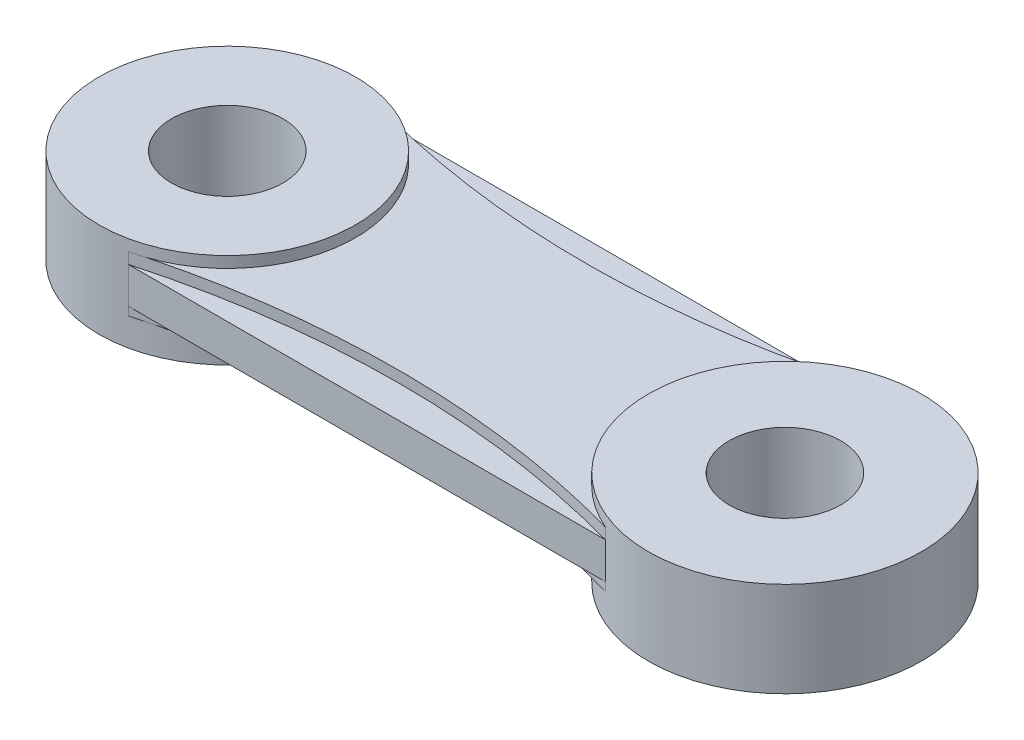
ISO-10303-21;
HEADER;
FILE_DESCRIPTION(('STEP AP214'),'2;1');
FILE_NAME('part.step','',(''),(''),'','','');
FILE_SCHEMA(('AUTOMOTIVE_DESIGN { 1 0 10303 214 1 1 1 1 }'));
ENDSEC;
DATA;
#1=APPLICATION_CONTEXT('core data for automotive mechanical design processes');
#2=APPLICATION_PROTOCOL_DEFINITION('international standard','automotive_design',2000,#1);
#3=PRODUCT_CONTEXT('',#1,'mechanical');
#4=PRODUCT('Part','Part','',(#3));
#5=PRODUCT_RELATED_PRODUCT_CATEGORY('part','',(#4));
#6=PRODUCT_DEFINITION_FORMATION('','',#4);
#7=PRODUCT_DEFINITION_CONTEXT('part definition',#1,'design');
#8=PRODUCT_DEFINITION('design','',#6,#7);
#9=PRODUCT_DEFINITION_SHAPE('','',#8);
#10=(LENGTH_UNIT() NAMED_UNIT(*) SI_UNIT(.MILLI.,.METRE.));
#11=(NAMED_UNIT(*) PLANE_ANGLE_UNIT() SI_UNIT($,.RADIAN.));
#12=(NAMED_UNIT(*) SI_UNIT($,.STERADIAN.) SOLID_ANGLE_UNIT());
#13=UNCERTAINTY_MEASURE_WITH_UNIT(LENGTH_MEASURE(1.E-05),#10,'distance_accuracy_value','');
#14=(GEOMETRIC_REPRESENTATION_CONTEXT(3) GLOBAL_UNCERTAINTY_ASSIGNED_CONTEXT((#13)) GLOBAL_UNIT_ASSIGNED_CONTEXT((#10,
#11,#12)) REPRESENTATION_CONTEXT('',''));
#15=CARTESIAN_POINT('',(0.,0.,0.));
#16=DIRECTION('',(0.,0.,1.));
#17=DIRECTION('',(1.,0.,0.));
#18=AXIS2_PLACEMENT_3D('',#15,#16,#17);
#19=CARTESIAN_POINT('',(0.,100.,0.));
#20=DIRECTION('',(0.,0.,-1.));
#21=DIRECTION('',(-1.,0.,0.));
#22=AXIS2_PLACEMENT_3D('',#19,#20,#21);
#23=PLANE('',#22);
#24=DIRECTION('',(-1.,0.,0.));
#25=VECTOR('',#24,1.);
#26=CARTESIAN_POINT('',(47.6969600708473,15.,0.));
#27=LINE('',#26,#25);
#28=CARTESIAN_POINT('',(903.046402851673,15.,0.));
#29=VERTEX_POINT('',#28);
#30=CARTESIAN_POINT('',(47.6969600708473,15.,0.));
#31=VERTEX_POINT('',#30);
#32=EDGE_CURVE('E234',#29,#31,#27,.T.);
#33=ORIENTED_EDGE('',*,*,#32,.F.);
#34=DIRECTION('',(0.,1.,0.));
#35=VECTOR('',#34,1.);
#36=CARTESIAN_POINT('',(903.046402851673,-50.,0.));
#37=LINE('',#36,#35);
#38=CARTESIAN_POINT('',(903.046402851673,80.,0.));
#39=VERTEX_POINT('',#38);
#40=EDGE_CURVE('E162',#29,#39,#37,.T.);
#41=ORIENTED_EDGE('',*,*,#40,.T.);
#42=DIRECTION('',(1.,0.,0.));
#43=VECTOR('',#42,1.);
#44=CARTESIAN_POINT('',(47.6969600708473,80.,0.));
#45=LINE('',#44,#43);
#46=CARTESIAN_POINT('',(47.6969600708473,80.,0.));
#47=VERTEX_POINT('',#46);
#48=EDGE_CURVE('E199',#47,#39,#45,.T.);
#49=ORIENTED_EDGE('',*,*,#48,.F.);
#50=DIRECTION('',(0.,1.,0.));
#51=VECTOR('',#50,1.);
#52=CARTESIAN_POINT('',(47.6969600708473,-50.,0.));
#53=LINE('',#52,#51);
#54=EDGE_CURVE('E120',#47,#31,#53,.F.);
#55=ORIENTED_EDGE('',*,*,#54,.T.);
#56=EDGE_LOOP('',(#33,#41,#49,#55));
#57=FACE_BOUND('',#56,.T.);
#58=ADVANCED_FACE('F32',(#57),#23,.F.);
#59=CARTESIAN_POINT('',(0.,100.,-450.));
#60=DIRECTION('',(0.,0.,1.));
#61=DIRECTION('',(1.,0.,0.));
#62=AXIS2_PLACEMENT_3D('',#59,#60,#61);
#63=PLANE('',#62);
#64=DIRECTION('',(0.,1.,0.));
#65=VECTOR('',#64,1.);
#66=CARTESIAN_POINT('',(903.046402851673,-50.,-450.));
#67=LINE('',#66,#65);
#68=CARTESIAN_POINT('',(903.046402851673,80.,-450.));
#69=VERTEX_POINT('',#68);
#70=CARTESIAN_POINT('',(903.046402851673,15.,-450.));
#71=VERTEX_POINT('',#70);
#72=EDGE_CURVE('E135',#69,#71,#67,.F.);
#73=ORIENTED_EDGE('',*,*,#72,.T.);
#74=DIRECTION('',(1.,0.,0.));
#75=VECTOR('',#74,1.);
#76=CARTESIAN_POINT('',(47.6969600708473,15.,-450.));
#77=LINE('',#76,#75);
#78=CARTESIAN_POINT('',(47.6969600708473,15.,-450.));
#79=VERTEX_POINT('',#78);
#80=EDGE_CURVE('E126',#79,#71,#77,.T.);
#81=ORIENTED_EDGE('',*,*,#80,.F.);
#82=DIRECTION('',(0.,1.,0.));
#83=VECTOR('',#82,1.);
#84=CARTESIAN_POINT('',(47.6969600708473,-50.,-450.));
#85=LINE('',#84,#83);
#86=CARTESIAN_POINT('',(47.6969600708473,80.,-450.));
#87=VERTEX_POINT('',#86);
#88=EDGE_CURVE('E121',#79,#87,#85,.T.);
#89=ORIENTED_EDGE('',*,*,#88,.T.);
#90=DIRECTION('',(-1.,0.,0.));
#91=VECTOR('',#90,1.);
#92=CARTESIAN_POINT('',(47.6969600708473,80.,-450.));
#93=LINE('',#92,#91);
#94=EDGE_CURVE('E190',#69,#87,#93,.T.);
#95=ORIENTED_EDGE('',*,*,#94,.F.);
#96=EDGE_LOOP('',(#73,#81,#89,#95));
#97=FACE_BOUND('',#96,.T.);
#98=ADVANCED_FACE('F131',(#97),#63,.F.);
#99=CARTESIAN_POINT('',(0.,100.,0.));
#100=DIRECTION('',(0.,-1.,0.));
#101=DIRECTION('',(0.,0.,-1.));
#102=AXIS2_PLACEMENT_3D('',#99,#100,#101);
#103=PLANE('',#102);
#104=CARTESIAN_POINT('',(1000.,100.,-225.));
#105=DIRECTION('',(0.,-1.,0.));
#106=DIRECTION('',(0.,0.,-1.));
#107=AXIS2_PLACEMENT_3D('',#104,#105,#106);
#108=CIRCLE('',#107,245.);
#109=CARTESIAN_POINT('',(903.046402851673,100.,0.));
#110=VERTEX_POINT('',#109);
#111=CARTESIAN_POINT('',(903.046402851673,100.,-450.));
#112=VERTEX_POINT('',#111);
#113=EDGE_CURVE('E165',#110,#112,#108,.T.);
#114=ORIENTED_EDGE('',*,*,#113,.T.);
#115=CARTESIAN_POINT('',(475.37168146126,100.,-1991.7828422588));
#116=DIRECTION('',(0.,1.,0.));
#117=DIRECTION('',(0.,0.,1.));
#118=AXIS2_PLACEMENT_3D('',#115,#116,#117);
#119=CIRCLE('',#118,1600.);
#120=CARTESIAN_POINT('',(71.6465221432204,100.,-443.556116054393));
#121=VERTEX_POINT('',#120);
#122=EDGE_CURVE('E172',#121,#112,#119,.T.);
#123=ORIENTED_EDGE('',*,*,#122,.F.);
#124=CARTESIAN_POINT('',(0.,100.,-225.));
#125=DIRECTION('',(0.,-1.,0.));
#126=DIRECTION('',(0.,0.,-1.));
#127=AXIS2_PLACEMENT_3D('',#124,#125,#126);
#128=CIRCLE('',#127,230.);
#129=CARTESIAN_POINT('',(71.6465221432031,100.,-6.44388394560197));
#130=VERTEX_POINT('',#129);
#131=EDGE_CURVE('E57',#121,#130,#128,.T.);
#132=ORIENTED_EDGE('',*,*,#131,.T.);
#133=CARTESIAN_POINT('',(475.37168146126,100.,1541.7828422588));
#134=DIRECTION('',(0.,1.,0.));
#135=DIRECTION('',(0.,0.,-1.));
#136=AXIS2_PLACEMENT_3D('',#133,#134,#135);
#137=CIRCLE('',#136,1600.);
#138=EDGE_CURVE('E200',#110,#130,#137,.T.);
#139=ORIENTED_EDGE('',*,*,#138,.F.);
#140=EDGE_LOOP('',(#114,#123,#132,#139));
#141=FACE_BOUND('',#140,.T.);
#142=ADVANCED_FACE('F230',(#141),#103,.F.);
#143=CARTESIAN_POINT('',(0.,0.,0.));
#144=DIRECTION('',(0.,-1.,0.));
#145=DIRECTION('',(0.,0.,-1.));
#146=AXIS2_PLACEMENT_3D('',#143,#144,#145);
#147=PLANE('',#146);
#148=CARTESIAN_POINT('',(475.37168146126,0.,-1991.7828422588));
#149=DIRECTION('',(0.,-1.,0.));
#150=DIRECTION('',(0.,0.,1.));
#151=AXIS2_PLACEMENT_3D('',#148,#149,#150);
#152=CIRCLE('',#151,1600.);
#153=CARTESIAN_POINT('',(903.046402851673,0.,-450.));
#154=VERTEX_POINT('',#153);
#155=CARTESIAN_POINT('',(71.6465221432202,0.,-443.556116054392));
#156=VERTEX_POINT('',#155);
#157=EDGE_CURVE('E49',#154,#156,#152,.T.);
#158=ORIENTED_EDGE('',*,*,#157,.F.);
#159=CARTESIAN_POINT('',(1000.,0.,-225.));
#160=DIRECTION('',(0.,-1.,0.));
#161=DIRECTION('',(0.,0.,-1.));
#162=AXIS2_PLACEMENT_3D('',#159,#160,#161);
#163=CIRCLE('',#162,245.);
#164=CARTESIAN_POINT('',(903.046402851673,0.,0.));
#165=VERTEX_POINT('',#164);
#166=EDGE_CURVE('E168',#165,#154,#163,.T.);
#167=ORIENTED_EDGE('',*,*,#166,.F.);
#168=CARTESIAN_POINT('',(475.37168146126,0.,1541.7828422588));
#169=DIRECTION('',(0.,-1.,0.));
#170=DIRECTION('',(0.,0.,-1.));
#171=AXIS2_PLACEMENT_3D('',#168,#169,#170);
#172=CIRCLE('',#171,1600.);
#173=CARTESIAN_POINT('',(71.6465221432031,0.,-6.44388394560202));
#174=VERTEX_POINT('',#173);
#175=EDGE_CURVE('E451',#174,#165,#172,.T.);
#176=ORIENTED_EDGE('',*,*,#175,.F.);
#177=CARTESIAN_POINT('',(0.,0.,-225.));
#178=DIRECTION('',(0.,-1.,0.));
#179=DIRECTION('',(0.,0.,-1.));
#180=AXIS2_PLACEMENT_3D('',#177,#178,#179);
#181=CIRCLE('',#180,230.);
#182=EDGE_CURVE('E40',#156,#174,#181,.T.);
#183=ORIENTED_EDGE('',*,*,#182,.F.);
#184=EDGE_LOOP('',(#158,#167,#176,#183));
#185=FACE_BOUND('',#184,.T.);
#186=ADVANCED_FACE('F373',(#185),#147,.T.);
#187=CARTESIAN_POINT('',(1000.,-50.,-225.));
#188=DIRECTION('',(0.,1.,0.));
#189=DIRECTION('',(0.,0.,1.));
#190=AXIS2_PLACEMENT_3D('',#187,#188,#189);
#191=CYLINDRICAL_SURFACE('',#190,245.);
#192=CARTESIAN_POINT('',(1000.,120.,-225.));
#193=DIRECTION('',(0.,1.,0.));
#194=DIRECTION('',(0.,0.,1.));
#195=AXIS2_PLACEMENT_3D('',#192,#193,#194);
#196=CIRCLE('',#195,245.);
#197=CARTESIAN_POINT('',(1000.,120.,20.));
#198=VERTEX_POINT('',#197);
#199=EDGE_CURVE('E154',#198,#198,#196,.T.);
#200=ORIENTED_EDGE('',*,*,#199,.F.);
#201=EDGE_LOOP('',(#200));
#202=FACE_BOUND('',#201,.T.);
#203=CARTESIAN_POINT('',(1000.,-50.,-225.));
#204=DIRECTION('',(0.,1.,0.));
#205=DIRECTION('',(0.,0.,1.));
#206=AXIS2_PLACEMENT_3D('',#203,#204,#205);
#207=CIRCLE('',#206,245.);
#208=CARTESIAN_POINT('',(1000.,-50.,20.));
#209=VERTEX_POINT('',#208);
#210=EDGE_CURVE('E157',#209,#209,#207,.T.);
#211=ORIENTED_EDGE('',*,*,#210,.T.);
#212=EDGE_LOOP('',(#211));
#213=FACE_BOUND('',#212,.T.);
#214=ORIENTED_EDGE('',*,*,#113,.F.);
#215=DIRECTION('',(0.,1.,0.));
#216=VECTOR('',#215,1.);
#217=CARTESIAN_POINT('',(903.046402851673,80.,0.));
#218=LINE('',#217,#216);
#219=EDGE_CURVE('E203',#39,#110,#218,.T.);
#220=ORIENTED_EDGE('',*,*,#219,.F.);
#221=ORIENTED_EDGE('',*,*,#40,.F.);
#222=EDGE_CURVE('E163',#165,#29,#37,.T.);
#223=ORIENTED_EDGE('',*,*,#222,.F.);
#224=ORIENTED_EDGE('',*,*,#166,.T.);
#225=DIRECTION('',(0.,-1.,0.));
#226=VECTOR('',#225,1.);
#227=CARTESIAN_POINT('',(903.046402851673,15.,-450.));
#228=LINE('',#227,#226);
#229=EDGE_CURVE('E136',#71,#154,#228,.T.);
#230=ORIENTED_EDGE('',*,*,#229,.F.);
#231=ORIENTED_EDGE('',*,*,#72,.F.);
#232=EDGE_CURVE('E160',#112,#69,#67,.F.);
#233=ORIENTED_EDGE('',*,*,#232,.F.);
#234=EDGE_LOOP('',(#214,#220,#221,#223,#224,#230,#231,#233));
#235=FACE_BOUND('',#234,.T.);
#236=ADVANCED_FACE('F249',(#202,#213,#235),#191,.T.);
#237=CARTESIAN_POINT('',(1000.,-50.,-225.));
#238=DIRECTION('',(0.,1.,0.));
#239=DIRECTION('',(0.,0.,1.));
#240=AXIS2_PLACEMENT_3D('',#237,#238,#239);
#241=PLANE('',#240);
#242=CARTESIAN_POINT('',(1000.,-50.,-225.));
#243=DIRECTION('',(0.,1.,0.));
#244=DIRECTION('',(0.,0.,1.));
#245=AXIS2_PLACEMENT_3D('',#242,#243,#244);
#246=CIRCLE('',#245,100.);
#247=CARTESIAN_POINT('',(1000.,-50.,-125.));
#248=VERTEX_POINT('',#247);
#249=EDGE_CURVE('E183',#248,#248,#246,.T.);
#250=ORIENTED_EDGE('',*,*,#249,.T.);
#251=EDGE_LOOP('',(#250));
#252=FACE_BOUND('',#251,.T.);
#253=ORIENTED_EDGE('',*,*,#210,.F.);
#254=EDGE_LOOP('',(#253));
#255=FACE_BOUND('',#254,.T.);
#256=ADVANCED_FACE('F315',(#252,#255),#241,.F.);
#257=CARTESIAN_POINT('',(1000.,120.,-225.));
#258=DIRECTION('',(0.,1.,0.));
#259=DIRECTION('',(0.,0.,1.));
#260=AXIS2_PLACEMENT_3D('',#257,#258,#259);
#261=PLANE('',#260);
#262=CARTESIAN_POINT('',(1000.,120.,-225.));
#263=DIRECTION('',(0.,1.,0.));
#264=DIRECTION('',(0.,0.,1.));
#265=AXIS2_PLACEMENT_3D('',#262,#263,#264);
#266=CIRCLE('',#265,100.);
#267=CARTESIAN_POINT('',(1000.,120.,-125.));
#268=VERTEX_POINT('',#267);
#269=EDGE_CURVE('E35',#268,#268,#266,.T.);
#270=ORIENTED_EDGE('',*,*,#269,.F.);
#271=EDGE_LOOP('',(#270));
#272=FACE_BOUND('',#271,.T.);
#273=ORIENTED_EDGE('',*,*,#199,.T.);
#274=EDGE_LOOP('',(#273));
#275=FACE_BOUND('',#274,.T.);
#276=ADVANCED_FACE('F213',(#272,#275),#261,.T.);
#277=CARTESIAN_POINT('',(0.,-50.,-225.));
#278=DIRECTION('',(0.,1.,0.));
#279=DIRECTION('',(0.,0.,1.));
#280=AXIS2_PLACEMENT_3D('',#277,#278,#279);
#281=CYLINDRICAL_SURFACE('',#280,230.);
#282=CARTESIAN_POINT('',(0.,120.,-225.));
#283=DIRECTION('',(0.,1.,0.));
#284=DIRECTION('',(0.,0.,1.));
#285=AXIS2_PLACEMENT_3D('',#282,#283,#284);
#286=CIRCLE('',#285,230.);
#287=CARTESIAN_POINT('',(0.,120.,5.));
#288=VERTEX_POINT('',#287);
#289=EDGE_CURVE('E145',#288,#288,#286,.T.);
#290=ORIENTED_EDGE('',*,*,#289,.F.);
#291=EDGE_LOOP('',(#290));
#292=FACE_BOUND('',#291,.T.);
#293=CARTESIAN_POINT('',(0.,-50.,-225.));
#294=DIRECTION('',(0.,1.,0.));
#295=DIRECTION('',(0.,0.,1.));
#296=AXIS2_PLACEMENT_3D('',#293,#294,#295);
#297=CIRCLE('',#296,230.);
#298=CARTESIAN_POINT('',(0.,-50.,5.));
#299=VERTEX_POINT('',#298);
#300=EDGE_CURVE('E143',#299,#299,#297,.T.);
#301=ORIENTED_EDGE('',*,*,#300,.T.);
#302=EDGE_LOOP('',(#301));
#303=FACE_BOUND('',#302,.T.);
#304=CARTESIAN_POINT('',(47.6969600708473,100.,-450.));
#305=VERTEX_POINT('',#304);
#306=EDGE_CURVE('E152',#305,#121,#128,.T.);
#307=ORIENTED_EDGE('',*,*,#306,.F.);
#308=DIRECTION('',(0.,1.,0.));
#309=VECTOR('',#308,1.);
#310=CARTESIAN_POINT('',(47.6969600708473,80.,-450.));
#311=LINE('',#310,#309);
#312=EDGE_CURVE('E142',#87,#305,#311,.T.);
#313=ORIENTED_EDGE('',*,*,#312,.F.);
#314=ORIENTED_EDGE('',*,*,#88,.F.);
#315=CARTESIAN_POINT('',(47.6969600708473,0.,-450.));
#316=VERTEX_POINT('',#315);
#317=EDGE_CURVE('E112',#316,#79,#85,.T.);
#318=ORIENTED_EDGE('',*,*,#317,.F.);
#319=EDGE_CURVE('E11',#316,#156,#181,.T.);
#320=ORIENTED_EDGE('',*,*,#319,.T.);
#321=ORIENTED_EDGE('',*,*,#182,.T.);
#322=CARTESIAN_POINT('',(47.6969600708473,0.,0.));
#323=VERTEX_POINT('',#322);
#324=EDGE_CURVE('E42',#174,#323,#181,.T.);
#325=ORIENTED_EDGE('',*,*,#324,.T.);
#326=DIRECTION('',(0.,-1.,0.));
#327=VECTOR('',#326,1.);
#328=CARTESIAN_POINT('',(47.6969600708473,15.,0.));
#329=LINE('',#328,#327);
#330=EDGE_CURVE('E242',#31,#323,#329,.T.);
#331=ORIENTED_EDGE('',*,*,#330,.F.);
#332=ORIENTED_EDGE('',*,*,#54,.F.);
#333=CARTESIAN_POINT('',(47.6969600708473,100.,0.));
#334=VERTEX_POINT('',#333);
#335=EDGE_CURVE('E149',#334,#47,#53,.F.);
#336=ORIENTED_EDGE('',*,*,#335,.F.);
#337=EDGE_CURVE('E151',#130,#334,#128,.T.);
#338=ORIENTED_EDGE('',*,*,#337,.F.);
#339=ORIENTED_EDGE('',*,*,#131,.F.);
#340=EDGE_LOOP('',(#307,#313,#314,#318,#320,#321,#325,#331,#332,#336,#338,#339));
#341=FACE_BOUND('',#340,.T.);
#342=ADVANCED_FACE('F140',(#292,#303,#341),#281,.T.);
#343=CARTESIAN_POINT('',(0.,-50.,-225.));
#344=DIRECTION('',(0.,1.,0.));
#345=DIRECTION('',(0.,0.,1.));
#346=AXIS2_PLACEMENT_3D('',#343,#344,#345);
#347=PLANE('',#346);
#348=CARTESIAN_POINT('',(0.,-50.,-225.));
#349=DIRECTION('',(0.,1.,0.));
#350=DIRECTION('',(0.,0.,1.));
#351=AXIS2_PLACEMENT_3D('',#348,#349,#350);
#352=CIRCLE('',#351,100.);
#353=CARTESIAN_POINT('',(0.,-50.,-125.));
#354=VERTEX_POINT('',#353);
#355=EDGE_CURVE('E173',#354,#354,#352,.T.);
#356=ORIENTED_EDGE('',*,*,#355,.T.);
#357=EDGE_LOOP('',(#356));
#358=FACE_BOUND('',#357,.T.);
#359=ORIENTED_EDGE('',*,*,#300,.F.);
#360=EDGE_LOOP('',(#359));
#361=FACE_BOUND('',#360,.T.);
#362=ADVANCED_FACE('F212',(#358,#361),#347,.F.);
#363=CARTESIAN_POINT('',(0.,120.,-225.));
#364=DIRECTION('',(0.,1.,0.));
#365=DIRECTION('',(0.,0.,1.));
#366=AXIS2_PLACEMENT_3D('',#363,#364,#365);
#367=PLANE('',#366);
#368=CARTESIAN_POINT('',(0.,120.,-225.));
#369=DIRECTION('',(0.,1.,0.));
#370=DIRECTION('',(0.,0.,1.));
#371=AXIS2_PLACEMENT_3D('',#368,#369,#370);
#372=CIRCLE('',#371,100.);
#373=CARTESIAN_POINT('',(0.,120.,-125.));
#374=VERTEX_POINT('',#373);
#375=EDGE_CURVE('E170',#374,#374,#372,.T.);
#376=ORIENTED_EDGE('',*,*,#375,.F.);
#377=EDGE_LOOP('',(#376));
#378=FACE_BOUND('',#377,.T.);
#379=ORIENTED_EDGE('',*,*,#289,.T.);
#380=EDGE_LOOP('',(#379));
#381=FACE_BOUND('',#380,.T.);
#382=ADVANCED_FACE('F208',(#378,#381),#367,.T.);
#383=CARTESIAN_POINT('',(475.37168146126,80.,1541.7828422588));
#384=DIRECTION('',(0.,1.,0.));
#385=DIRECTION('',(0.,0.,1.));
#386=AXIS2_PLACEMENT_3D('',#383,#384,#385);
#387=CYLINDRICAL_SURFACE('',#386,1600.);
#388=ORIENTED_EDGE('',*,*,#138,.T.);
#389=EDGE_CURVE('E195',#130,#334,#137,.T.);
#390=ORIENTED_EDGE('',*,*,#389,.T.);
#391=ORIENTED_EDGE('',*,*,#335,.T.);
#392=CARTESIAN_POINT('',(475.37168146126,80.,1541.7828422588));
#393=DIRECTION('',(0.,1.,0.));
#394=DIRECTION('',(0.,0.,-1.));
#395=AXIS2_PLACEMENT_3D('',#392,#393,#394);
#396=CIRCLE('',#395,1600.);
#397=EDGE_CURVE('E196',#39,#47,#396,.T.);
#398=ORIENTED_EDGE('',*,*,#397,.F.);
#399=ORIENTED_EDGE('',*,*,#219,.T.);
#400=EDGE_LOOP('',(#388,#390,#391,#398,#399));
#401=FACE_BOUND('',#400,.T.);
#402=ADVANCED_FACE('F222',(#401),#387,.F.);
#403=CARTESIAN_POINT('',(475.37168146126,80.,1541.7828422588));
#404=DIRECTION('',(0.,-1.,0.));
#405=DIRECTION('',(0.,0.,-1.));
#406=AXIS2_PLACEMENT_3D('',#403,#404,#405);
#407=PLANE('',#406);
#408=ORIENTED_EDGE('',*,*,#397,.T.);
#409=ORIENTED_EDGE('',*,*,#48,.T.);
#410=EDGE_LOOP('',(#408,#409));
#411=FACE_BOUND('',#410,.T.);
#412=ADVANCED_FACE('F273',(#411),#407,.F.);
#413=CARTESIAN_POINT('',(475.37168146126,100.,1541.7828422588));
#414=DIRECTION('',(0.,-1.,0.));
#415=DIRECTION('',(0.,0.,-1.));
#416=AXIS2_PLACEMENT_3D('',#413,#414,#415);
#417=PLANE('',#416);
#418=ORIENTED_EDGE('',*,*,#389,.F.);
#419=ORIENTED_EDGE('',*,*,#337,.T.);
#420=EDGE_LOOP('',(#418,#419));
#421=FACE_BOUND('',#420,.T.);
#422=ADVANCED_FACE('F268',(#421),#417,.T.);
#423=CARTESIAN_POINT('',(475.37168146126,80.,-1991.7828422588));
#424=DIRECTION('',(0.,1.,0.));
#425=DIRECTION('',(0.,0.,1.));
#426=AXIS2_PLACEMENT_3D('',#423,#424,#425);
#427=CYLINDRICAL_SURFACE('',#426,1600.);
#428=EDGE_CURVE('E176',#305,#121,#119,.T.);
#429=ORIENTED_EDGE('',*,*,#428,.T.);
#430=ORIENTED_EDGE('',*,*,#122,.T.);
#431=ORIENTED_EDGE('',*,*,#232,.T.);
#432=CARTESIAN_POINT('',(475.37168146126,80.,-1991.7828422588));
#433=DIRECTION('',(0.,1.,0.));
#434=DIRECTION('',(0.,0.,1.));
#435=AXIS2_PLACEMENT_3D('',#432,#433,#434);
#436=CIRCLE('',#435,1600.);
#437=EDGE_CURVE('E187',#87,#69,#436,.T.);
#438=ORIENTED_EDGE('',*,*,#437,.F.);
#439=ORIENTED_EDGE('',*,*,#312,.T.);
#440=EDGE_LOOP('',(#429,#430,#431,#438,#439));
#441=FACE_BOUND('',#440,.T.);
#442=ADVANCED_FACE('F255',(#441),#427,.F.);
#443=CARTESIAN_POINT('',(475.37168146126,80.,-1991.7828422588));
#444=DIRECTION('',(0.,1.,0.));
#445=DIRECTION('',(0.,0.,1.));
#446=AXIS2_PLACEMENT_3D('',#443,#444,#445);
#447=PLANE('',#446);
#448=ORIENTED_EDGE('',*,*,#437,.T.);
#449=ORIENTED_EDGE('',*,*,#94,.T.);
#450=EDGE_LOOP('',(#448,#449));
#451=FACE_BOUND('',#450,.T.);
#452=ADVANCED_FACE('F257',(#451),#447,.T.);
#453=CARTESIAN_POINT('',(475.37168146126,100.,-1991.7828422588));
#454=DIRECTION('',(0.,1.,0.));
#455=DIRECTION('',(0.,0.,1.));
#456=AXIS2_PLACEMENT_3D('',#453,#454,#455);
#457=PLANE('',#456);
#458=ORIENTED_EDGE('',*,*,#306,.T.);
#459=ORIENTED_EDGE('',*,*,#428,.F.);
#460=EDGE_LOOP('',(#458,#459));
#461=FACE_BOUND('',#460,.T.);
#462=ADVANCED_FACE('F259',(#461),#457,.F.);
#463=CARTESIAN_POINT('',(0.,-50.,-225.));
#464=DIRECTION('',(0.,1.,0.));
#465=DIRECTION('',(0.,0.,1.));
#466=AXIS2_PLACEMENT_3D('',#463,#464,#465);
#467=CYLINDRICAL_SURFACE('',#466,100.);
#468=ORIENTED_EDGE('',*,*,#375,.T.);
#469=EDGE_LOOP('',(#468));
#470=FACE_BOUND('',#469,.T.);
#471=ORIENTED_EDGE('',*,*,#355,.F.);
#472=EDGE_LOOP('',(#471));
#473=FACE_BOUND('',#472,.T.);
#474=ADVANCED_FACE('F265',(#470,#473),#467,.F.);
#475=CARTESIAN_POINT('',(1000.,-50.,-225.));
#476=DIRECTION('',(0.,1.,0.));
#477=DIRECTION('',(0.,0.,1.));
#478=AXIS2_PLACEMENT_3D('',#475,#476,#477);
#479=CYLINDRICAL_SURFACE('',#478,100.);
#480=ORIENTED_EDGE('',*,*,#269,.T.);
#481=EDGE_LOOP('',(#480));
#482=FACE_BOUND('',#481,.T.);
#483=ORIENTED_EDGE('',*,*,#249,.F.);
#484=EDGE_LOOP('',(#483));
#485=FACE_BOUND('',#484,.T.);
#486=ADVANCED_FACE('F348',(#482,#485),#479,.F.);
#487=CARTESIAN_POINT('',(475.37168146126,15.,1541.7828422588));
#488=DIRECTION('',(0.,-1.,0.));
#489=DIRECTION('',(0.,0.,-1.));
#490=AXIS2_PLACEMENT_3D('',#487,#488,#489);
#491=CYLINDRICAL_SURFACE('',#490,1600.);
#492=EDGE_CURVE('E456',#323,#174,#172,.T.);
#493=ORIENTED_EDGE('',*,*,#492,.T.);
#494=ORIENTED_EDGE('',*,*,#175,.T.);
#495=ORIENTED_EDGE('',*,*,#222,.T.);
#496=CARTESIAN_POINT('',(475.37168146126,15.,1541.7828422588));
#497=DIRECTION('',(0.,-1.,0.));
#498=DIRECTION('',(0.,0.,-1.));
#499=AXIS2_PLACEMENT_3D('',#496,#497,#498);
#500=CIRCLE('',#499,1600.);
#501=EDGE_CURVE('E243',#31,#29,#500,.T.);
#502=ORIENTED_EDGE('',*,*,#501,.F.);
#503=ORIENTED_EDGE('',*,*,#330,.T.);
#504=EDGE_LOOP('',(#493,#494,#495,#502,#503));
#505=FACE_BOUND('',#504,.T.);
#506=ADVANCED_FACE('F355',(#505),#491,.F.);
#507=CARTESIAN_POINT('',(475.37168146126,15.,1541.7828422588));
#508=DIRECTION('',(0.,-1.,0.));
#509=DIRECTION('',(0.,0.,-1.));
#510=AXIS2_PLACEMENT_3D('',#507,#508,#509);
#511=PLANE('',#510);
#512=ORIENTED_EDGE('',*,*,#501,.T.);
#513=ORIENTED_EDGE('',*,*,#32,.T.);
#514=EDGE_LOOP('',(#512,#513));
#515=FACE_BOUND('',#514,.T.);
#516=ADVANCED_FACE('F398',(#515),#511,.T.);
#517=CARTESIAN_POINT('',(475.37168146126,0.,1541.7828422588));
#518=DIRECTION('',(0.,-1.,0.));
#519=DIRECTION('',(0.,0.,-1.));
#520=AXIS2_PLACEMENT_3D('',#517,#518,#519);
#521=PLANE('',#520);
#522=ORIENTED_EDGE('',*,*,#324,.F.);
#523=ORIENTED_EDGE('',*,*,#492,.F.);
#524=EDGE_LOOP('',(#522,#523));
#525=FACE_BOUND('',#524,.T.);
#526=ADVANCED_FACE('F408',(#525),#521,.F.);
#527=CARTESIAN_POINT('',(475.37168146126,15.,-1991.7828422588));
#528=DIRECTION('',(0.,-1.,0.));
#529=DIRECTION('',(0.,0.,-1.));
#530=AXIS2_PLACEMENT_3D('',#527,#528,#529);
#531=CYLINDRICAL_SURFACE('',#530,1600.);
#532=ORIENTED_EDGE('',*,*,#157,.T.);
#533=EDGE_CURVE('E117',#156,#316,#152,.T.);
#534=ORIENTED_EDGE('',*,*,#533,.T.);
#535=ORIENTED_EDGE('',*,*,#317,.T.);
#536=CARTESIAN_POINT('',(475.37168146126,15.,-1991.7828422588));
#537=DIRECTION('',(0.,-1.,0.));
#538=DIRECTION('',(0.,0.,1.));
#539=AXIS2_PLACEMENT_3D('',#536,#537,#538);
#540=CIRCLE('',#539,1600.);
#541=EDGE_CURVE('E115',#71,#79,#540,.T.);
#542=ORIENTED_EDGE('',*,*,#541,.F.);
#543=ORIENTED_EDGE('',*,*,#229,.T.);
#544=EDGE_LOOP('',(#532,#534,#535,#542,#543));
#545=FACE_BOUND('',#544,.T.);
#546=ADVANCED_FACE('F114',(#545),#531,.F.);
#547=CARTESIAN_POINT('',(475.37168146126,15.,-1991.7828422588));
#548=DIRECTION('',(0.,1.,0.));
#549=DIRECTION('',(0.,0.,1.));
#550=AXIS2_PLACEMENT_3D('',#547,#548,#549);
#551=PLANE('',#550);
#552=ORIENTED_EDGE('',*,*,#541,.T.);
#553=ORIENTED_EDGE('',*,*,#80,.T.);
#554=EDGE_LOOP('',(#552,#553));
#555=FACE_BOUND('',#554,.T.);
#556=ADVANCED_FACE('F125',(#555),#551,.F.);
#557=CARTESIAN_POINT('',(475.37168146126,0.,-1991.7828422588));
#558=DIRECTION('',(0.,1.,0.));
#559=DIRECTION('',(0.,0.,1.));
#560=AXIS2_PLACEMENT_3D('',#557,#558,#559);
#561=PLANE('',#560);
#562=ORIENTED_EDGE('',*,*,#533,.F.);
#563=ORIENTED_EDGE('',*,*,#319,.F.);
#564=EDGE_LOOP('',(#562,#563));
#565=FACE_BOUND('',#564,.T.);
#566=ADVANCED_FACE('F434',(#565),#561,.T.);
#567=CLOSED_SHELL('',(#58,#98,#142,#186,#236,#256,#276,#342,#362,#382,#402,#412,#422,#442,#452,
#462,#474,#486,#506,#516,#526,#546,#556,#566));
#568=MANIFOLD_SOLID_BREP('B2',#567);
#569=ADVANCED_BREP_SHAPE_REPRESENTATION('',(#18,#568),#14);
#570=SHAPE_DEFINITION_REPRESENTATION(#9,#569);
ENDSEC;
END-ISO-10303-21;
